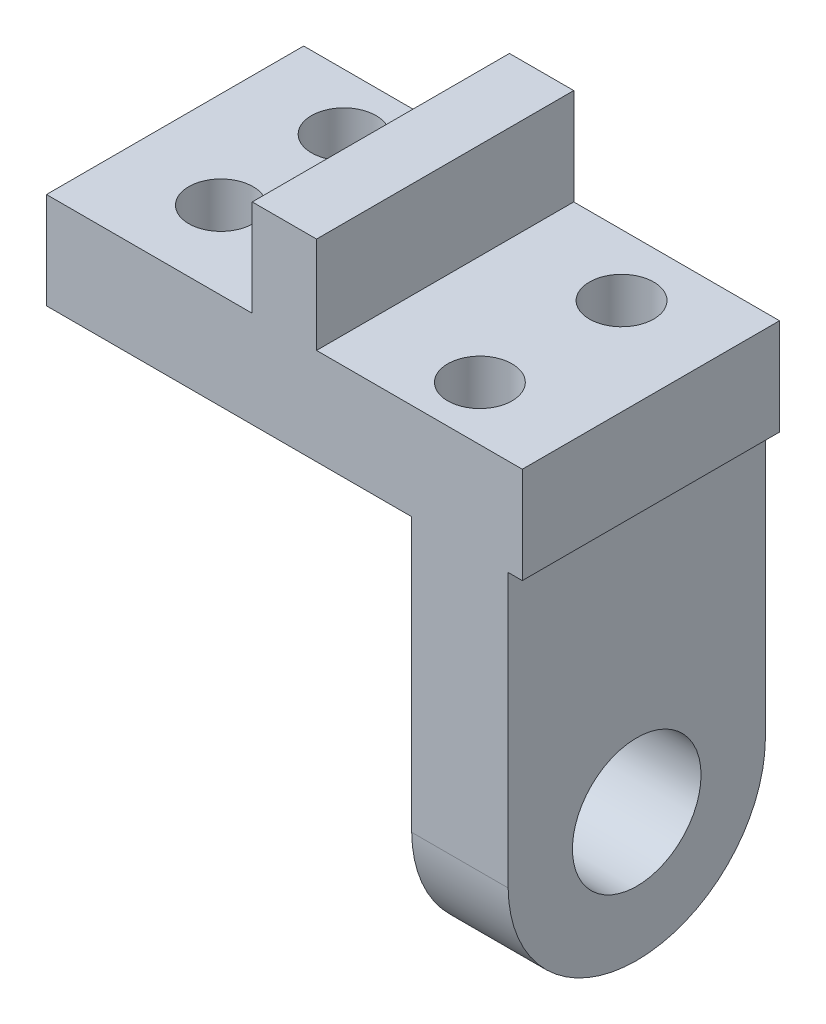
ISO-10303-21;
HEADER;
FILE_DESCRIPTION(('STEP AP214'),'2;1');
FILE_NAME('part.step','',(''),(''),'','','');
FILE_SCHEMA(('AUTOMOTIVE_DESIGN { 1 0 10303 214 1 1 1 1 }'));
ENDSEC;
DATA;
#1=APPLICATION_CONTEXT('core data for automotive mechanical design processes');
#2=APPLICATION_PROTOCOL_DEFINITION('international standard','automotive_design',2000,#1);
#3=PRODUCT_CONTEXT('',#1,'mechanical');
#4=PRODUCT('Part','Part','',(#3));
#5=PRODUCT_RELATED_PRODUCT_CATEGORY('part','',(#4));
#6=PRODUCT_DEFINITION_FORMATION('','',#4);
#7=PRODUCT_DEFINITION_CONTEXT('part definition',#1,'design');
#8=PRODUCT_DEFINITION('design','',#6,#7);
#9=PRODUCT_DEFINITION_SHAPE('','',#8);
#10=(LENGTH_UNIT() NAMED_UNIT(*) SI_UNIT(.MILLI.,.METRE.));
#11=(NAMED_UNIT(*) PLANE_ANGLE_UNIT() SI_UNIT($,.RADIAN.));
#12=(NAMED_UNIT(*) SI_UNIT($,.STERADIAN.) SOLID_ANGLE_UNIT());
#13=UNCERTAINTY_MEASURE_WITH_UNIT(LENGTH_MEASURE(1.E-05),#10,'distance_accuracy_value','');
#14=(GEOMETRIC_REPRESENTATION_CONTEXT(3) GLOBAL_UNCERTAINTY_ASSIGNED_CONTEXT((#13)) GLOBAL_UNIT_ASSIGNED_CONTEXT((#10,
#11,#12)) REPRESENTATION_CONTEXT('',''));
#15=CARTESIAN_POINT('',(0.,0.,0.));
#16=DIRECTION('',(0.,0.,1.));
#17=DIRECTION('',(1.,0.,0.));
#18=AXIS2_PLACEMENT_3D('',#15,#16,#17);
#19=CARTESIAN_POINT('',(-56.7948717948718,0.,20.));
#20=DIRECTION('',(0.,1.,0.));
#21=DIRECTION('',(0.,0.,1.));
#22=AXIS2_PLACEMENT_3D('',#19,#20,#21);
#23=PLANE('',#22);
#24=CARTESIAN_POINT('',(-41.7948717948718,0.,-11.2384801925491));
#25=DIRECTION('',(0.,1.,0.));
#26=DIRECTION('',(0.,0.,1.));
#27=AXIS2_PLACEMENT_3D('',#24,#25,#26);
#28=CIRCLE('',#27,5.02469610578036);
#29=CARTESIAN_POINT('',(-41.7948717948718,0.,-6.21378408676869));
#30=VERTEX_POINT('',#29);
#31=EDGE_CURVE('E218',#30,#30,#28,.T.);
#32=ORIENTED_EDGE('',*,*,#31,.T.);
#33=EDGE_LOOP('',(#32));
#34=FACE_BOUND('',#33,.T.);
#35=CARTESIAN_POINT('',(-41.7948717948718,0.,7.87493505307092));
#36=DIRECTION('',(0.,1.,0.));
#37=DIRECTION('',(0.,0.,1.));
#38=AXIS2_PLACEMENT_3D('',#35,#36,#37);
#39=CIRCLE('',#38,5.);
#40=CARTESIAN_POINT('',(-41.7948717948718,0.,12.8749350530709));
#41=VERTEX_POINT('',#40);
#42=EDGE_CURVE('E217',#41,#41,#39,.T.);
#43=ORIENTED_EDGE('',*,*,#42,.T.);
#44=EDGE_LOOP('',(#43));
#45=FACE_BOUND('',#44,.T.);
#46=DIRECTION('',(0.,0.,-1.));
#47=VECTOR('',#46,1.);
#48=CARTESIAN_POINT('',(0.,0.,20.));
#49=LINE('',#48,#47);
#50=CARTESIAN_POINT('',(0.,0.,20.));
#51=VERTEX_POINT('',#50);
#52=CARTESIAN_POINT('',(0.,0.,16.0855610603018));
#53=VERTEX_POINT('',#52);
#54=EDGE_CURVE('E58',#51,#53,#49,.T.);
#55=ORIENTED_EDGE('',*,*,#54,.F.);
#56=DIRECTION('',(1.,0.,0.));
#57=VECTOR('',#56,1.);
#58=CARTESIAN_POINT('',(-56.7948717948718,0.,20.));
#59=LINE('',#58,#57);
#60=CARTESIAN_POINT('',(-56.7948717948718,0.,20.));
#61=VERTEX_POINT('',#60);
#62=EDGE_CURVE('E254',#61,#51,#59,.T.);
#63=ORIENTED_EDGE('',*,*,#62,.F.);
#64=DIRECTION('',(0.,0.,-1.));
#65=VECTOR('',#64,1.);
#66=CARTESIAN_POINT('',(-56.7948717948718,0.,20.));
#67=LINE('',#66,#65);
#68=CARTESIAN_POINT('',(-56.7948717948718,0.,-20.));
#69=VERTEX_POINT('',#68);
#70=EDGE_CURVE('E281',#61,#69,#67,.T.);
#71=ORIENTED_EDGE('',*,*,#70,.T.);
#72=DIRECTION('',(1.,0.,0.));
#73=VECTOR('',#72,1.);
#74=CARTESIAN_POINT('',(-56.7948717948718,0.,-20.));
#75=LINE('',#74,#73);
#76=CARTESIAN_POINT('',(0.,0.,-20.));
#77=VERTEX_POINT('',#76);
#78=EDGE_CURVE('E266',#69,#77,#75,.T.);
#79=ORIENTED_EDGE('',*,*,#78,.T.);
#80=CARTESIAN_POINT('',(0.,0.,-14.9231791384759));
#81=VERTEX_POINT('',#80);
#82=EDGE_CURVE('E193',#81,#77,#49,.T.);
#83=ORIENTED_EDGE('',*,*,#82,.F.);
#84=CARTESIAN_POINT('',(2.20512820512817,0.,-10.4357066205714));
#85=DIRECTION('',(0.,1.,0.));
#86=DIRECTION('',(0.,0.,1.));
#87=AXIS2_PLACEMENT_3D('',#84,#85,#86);
#88=CIRCLE('',#87,5.);
#89=CARTESIAN_POINT('',(0.,0.,-5.94823410266688));
#90=VERTEX_POINT('',#89);
#91=EDGE_CURVE('E211',#81,#90,#88,.T.);
#92=ORIENTED_EDGE('',*,*,#91,.T.);
#93=CARTESIAN_POINT('',(0.,0.,7.11061602449279));
#94=VERTEX_POINT('',#93);
#95=EDGE_CURVE('E192',#94,#90,#49,.T.);
#96=ORIENTED_EDGE('',*,*,#95,.F.);
#97=CARTESIAN_POINT('',(2.20512820512817,0.,11.5980885423973));
#98=DIRECTION('',(0.,1.,0.));
#99=DIRECTION('',(0.,0.,1.));
#100=AXIS2_PLACEMENT_3D('',#97,#98,#99);
#101=CIRCLE('',#100,5.);
#102=EDGE_CURVE('E206',#94,#53,#101,.T.);
#103=ORIENTED_EDGE('',*,*,#102,.T.);
#104=EDGE_LOOP('',(#55,#63,#71,#79,#83,#92,#96,#103));
#105=FACE_BOUND('',#104,.T.);
#106=ADVANCED_FACE('F35',(#34,#45,#105),#23,.F.);
#107=CARTESIAN_POINT('',(2.20512820512817,-15.,-10.4357066205714));
#108=DIRECTION('',(0.,1.,0.));
#109=DIRECTION('',(0.,0.,1.));
#110=AXIS2_PLACEMENT_3D('',#107,#108,#109);
#111=CYLINDRICAL_SURFACE('',#110,5.);
#112=CARTESIAN_POINT('',(2.20512820512817,15.,-10.4357066205714));
#113=DIRECTION('',(0.,1.,0.));
#114=DIRECTION('',(0.,0.,1.));
#115=AXIS2_PLACEMENT_3D('',#112,#113,#114);
#116=CIRCLE('',#115,5.);
#117=CARTESIAN_POINT('',(2.20512820512817,15.,-5.43570662057139));
#118=VERTEX_POINT('',#117);
#119=EDGE_CURVE('E208',#118,#118,#116,.T.);
#120=ORIENTED_EDGE('',*,*,#119,.T.);
#121=EDGE_LOOP('',(#120));
#122=FACE_BOUND('',#121,.T.);
#123=DIRECTION('',(0.,1.,0.));
#124=VECTOR('',#123,1.);
#125=CARTESIAN_POINT('',(0.,-15.,-14.9231791384759));
#126=LINE('',#125,#124);
#127=CARTESIAN_POINT('',(0.,7.5,-14.9231791384759));
#128=VERTEX_POINT('',#127);
#129=EDGE_CURVE('E197',#128,#81,#126,.F.);
#130=ORIENTED_EDGE('',*,*,#129,.F.);
#131=CARTESIAN_POINT('',(2.20512820512817,7.5,-10.4357066205714));
#132=DIRECTION('',(0.,1.,0.));
#133=DIRECTION('',(0.,0.,1.));
#134=AXIS2_PLACEMENT_3D('',#131,#132,#133);
#135=CIRCLE('',#134,5.);
#136=CARTESIAN_POINT('',(0.,7.5,-5.94823410266688));
#137=VERTEX_POINT('',#136);
#138=EDGE_CURVE('E200',#128,#137,#135,.F.);
#139=ORIENTED_EDGE('',*,*,#138,.T.);
#140=DIRECTION('',(0.,1.,0.));
#141=VECTOR('',#140,1.);
#142=CARTESIAN_POINT('',(0.,-15.,-5.94823410266688));
#143=LINE('',#142,#141);
#144=EDGE_CURVE('E194',#90,#137,#143,.T.);
#145=ORIENTED_EDGE('',*,*,#144,.F.);
#146=ORIENTED_EDGE('',*,*,#91,.F.);
#147=EDGE_LOOP('',(#130,#139,#145,#146));
#148=FACE_BOUND('',#147,.T.);
#149=ADVANCED_FACE('F311',(#122,#148),#111,.F.);
#150=CARTESIAN_POINT('',(2.20512820512817,-15.,11.5980885423973));
#151=DIRECTION('',(0.,1.,0.));
#152=DIRECTION('',(0.,0.,1.));
#153=AXIS2_PLACEMENT_3D('',#150,#151,#152);
#154=CYLINDRICAL_SURFACE('',#153,5.);
#155=CARTESIAN_POINT('',(2.20512820512817,15.,11.5980885423973));
#156=DIRECTION('',(0.,1.,0.));
#157=DIRECTION('',(0.,0.,1.));
#158=AXIS2_PLACEMENT_3D('',#155,#156,#157);
#159=CIRCLE('',#158,5.);
#160=CARTESIAN_POINT('',(2.20512820512817,15.,16.5980885423973));
#161=VERTEX_POINT('',#160);
#162=EDGE_CURVE('E203',#161,#161,#159,.T.);
#163=ORIENTED_EDGE('',*,*,#162,.T.);
#164=EDGE_LOOP('',(#163));
#165=FACE_BOUND('',#164,.T.);
#166=DIRECTION('',(0.,1.,0.));
#167=VECTOR('',#166,1.);
#168=CARTESIAN_POINT('',(0.,-15.,7.11061602449279));
#169=LINE('',#168,#167);
#170=CARTESIAN_POINT('',(0.,7.5,7.11061602449279));
#171=VERTEX_POINT('',#170);
#172=EDGE_CURVE('E11',#171,#94,#169,.F.);
#173=ORIENTED_EDGE('',*,*,#172,.F.);
#174=CARTESIAN_POINT('',(2.20512820512817,7.5,11.5980885423973));
#175=DIRECTION('',(0.,1.,0.));
#176=DIRECTION('',(0.,0.,1.));
#177=AXIS2_PLACEMENT_3D('',#174,#175,#176);
#178=CIRCLE('',#177,5.);
#179=CARTESIAN_POINT('',(0.,7.5,16.0855610603018));
#180=VERTEX_POINT('',#179);
#181=EDGE_CURVE('E43',#171,#180,#178,.F.);
#182=ORIENTED_EDGE('',*,*,#181,.T.);
#183=DIRECTION('',(0.,1.,0.));
#184=VECTOR('',#183,1.);
#185=CARTESIAN_POINT('',(0.,-15.,16.0855610603018));
#186=LINE('',#185,#184);
#187=EDGE_CURVE('E284',#53,#180,#186,.T.);
#188=ORIENTED_EDGE('',*,*,#187,.F.);
#189=ORIENTED_EDGE('',*,*,#102,.F.);
#190=EDGE_LOOP('',(#173,#182,#188,#189));
#191=FACE_BOUND('',#190,.T.);
#192=ADVANCED_FACE('F290',(#165,#191),#154,.F.);
#193=CARTESIAN_POINT('',(-56.7948717948718,15.,20.));
#194=DIRECTION('',(0.,-1.,0.));
#195=DIRECTION('',(0.,0.,-1.));
#196=AXIS2_PLACEMENT_3D('',#193,#194,#195);
#197=PLANE('',#196);
#198=CARTESIAN_POINT('',(-41.7948717948718,15.,7.87493505307092));
#199=DIRECTION('',(0.,1.,0.));
#200=DIRECTION('',(0.,0.,1.));
#201=AXIS2_PLACEMENT_3D('',#198,#199,#200);
#202=CIRCLE('',#201,5.);
#203=CARTESIAN_POINT('',(-41.7948717948718,15.,12.8749350530709));
#204=VERTEX_POINT('',#203);
#205=EDGE_CURVE('E214',#204,#204,#202,.T.);
#206=ORIENTED_EDGE('',*,*,#205,.F.);
#207=EDGE_LOOP('',(#206));
#208=FACE_BOUND('',#207,.T.);
#209=CARTESIAN_POINT('',(-41.7948717948718,15.,-11.2384801925491));
#210=DIRECTION('',(0.,-1.,0.));
#211=DIRECTION('',(0.,0.,-1.));
#212=AXIS2_PLACEMENT_3D('',#209,#210,#211);
#213=CIRCLE('',#212,5.02469610578036);
#214=CARTESIAN_POINT('',(-41.7948717948718,15.,-16.2631762983294));
#215=VERTEX_POINT('',#214);
#216=EDGE_CURVE('E221',#215,#215,#213,.T.);
#217=ORIENTED_EDGE('',*,*,#216,.T.);
#218=EDGE_LOOP('',(#217));
#219=FACE_BOUND('',#218,.T.);
#220=DIRECTION('',(0.,0.,1.));
#221=VECTOR('',#220,1.);
#222=CARTESIAN_POINT('',(-24.7948717948718,15.,20.));
#223=LINE('',#222,#221);
#224=CARTESIAN_POINT('',(-24.7948717948718,15.,-20.));
#225=VERTEX_POINT('',#224);
#226=CARTESIAN_POINT('',(-24.7948717948718,15.,20.));
#227=VERTEX_POINT('',#226);
#228=EDGE_CURVE('E247',#225,#227,#223,.T.);
#229=ORIENTED_EDGE('',*,*,#228,.F.);
#230=DIRECTION('',(-1.,0.,0.));
#231=VECTOR('',#230,1.);
#232=CARTESIAN_POINT('',(-56.7948717948718,15.,-20.));
#233=LINE('',#232,#231);
#234=CARTESIAN_POINT('',(-56.7948717948718,15.,-20.));
#235=VERTEX_POINT('',#234);
#236=EDGE_CURVE('E270',#225,#235,#233,.T.);
#237=ORIENTED_EDGE('',*,*,#236,.T.);
#238=DIRECTION('',(0.,0.,-1.));
#239=VECTOR('',#238,1.);
#240=CARTESIAN_POINT('',(-56.7948717948718,15.,20.));
#241=LINE('',#240,#239);
#242=CARTESIAN_POINT('',(-56.7948717948718,15.,20.));
#243=VERTEX_POINT('',#242);
#244=EDGE_CURVE('E262',#243,#235,#241,.T.);
#245=ORIENTED_EDGE('',*,*,#244,.F.);
#246=DIRECTION('',(-1.,0.,0.));
#247=VECTOR('',#246,1.);
#248=CARTESIAN_POINT('',(-56.7948717948718,15.,20.));
#249=LINE('',#248,#247);
#250=EDGE_CURVE('E258',#227,#243,#249,.T.);
#251=ORIENTED_EDGE('',*,*,#250,.F.);
#252=EDGE_LOOP('',(#229,#237,#245,#251));
#253=FACE_BOUND('',#252,.T.);
#254=ADVANCED_FACE('F329',(#208,#219,#253),#197,.F.);
#255=CARTESIAN_POINT('',(-56.7948717948718,15.,20.));
#256=DIRECTION('',(1.,0.,0.));
#257=DIRECTION('',(0.,0.,-1.));
#258=AXIS2_PLACEMENT_3D('',#255,#256,#257);
#259=PLANE('',#258);
#260=DIRECTION('',(0.,-1.,0.));
#261=VECTOR('',#260,1.);
#262=CARTESIAN_POINT('',(-56.7948717948718,15.,-20.));
#263=LINE('',#262,#261);
#264=EDGE_CURVE('E249',#235,#69,#263,.T.);
#265=ORIENTED_EDGE('',*,*,#264,.T.);
#266=ORIENTED_EDGE('',*,*,#70,.F.);
#267=DIRECTION('',(0.,-1.,0.));
#268=VECTOR('',#267,1.);
#269=CARTESIAN_POINT('',(-56.7948717948718,15.,20.));
#270=LINE('',#269,#268);
#271=EDGE_CURVE('E250',#243,#61,#270,.T.);
#272=ORIENTED_EDGE('',*,*,#271,.F.);
#273=ORIENTED_EDGE('',*,*,#244,.T.);
#274=EDGE_LOOP('',(#265,#266,#272,#273));
#275=FACE_BOUND('',#274,.T.);
#276=ADVANCED_FACE('F37',(#275),#259,.F.);
#277=CARTESIAN_POINT('',(15.,0.,20.));
#278=VERTEX_POINT('',#277);
#279=CARTESIAN_POINT('',(17.2051282051282,0.,20.));
#280=VERTEX_POINT('',#279);
#281=EDGE_CURVE('E50',#278,#280,#59,.T.);
#282=ORIENTED_EDGE('',*,*,#281,.F.);
#283=DIRECTION('',(0.,0.,-1.));
#284=VECTOR('',#283,1.);
#285=CARTESIAN_POINT('',(15.,0.,20.));
#286=LINE('',#285,#284);
#287=CARTESIAN_POINT('',(15.,0.,-20.));
#288=VERTEX_POINT('',#287);
#289=EDGE_CURVE('E156',#278,#288,#286,.T.);
#290=ORIENTED_EDGE('',*,*,#289,.T.);
#291=CARTESIAN_POINT('',(17.2051282051282,0.,-20.));
#292=VERTEX_POINT('',#291);
#293=EDGE_CURVE('E265',#288,#292,#75,.T.);
#294=ORIENTED_EDGE('',*,*,#293,.T.);
#295=DIRECTION('',(0.,0.,-1.));
#296=VECTOR('',#295,1.);
#297=CARTESIAN_POINT('',(17.2051282051282,0.,20.));
#298=LINE('',#297,#296);
#299=EDGE_CURVE('E278',#280,#292,#298,.T.);
#300=ORIENTED_EDGE('',*,*,#299,.F.);
#301=EDGE_LOOP('',(#282,#290,#294,#300));
#302=FACE_BOUND('',#301,.T.);
#303=ADVANCED_FACE('F313',(#302),#23,.F.);
#304=CARTESIAN_POINT('',(17.2051282051282,15.,20.));
#305=DIRECTION('',(-1.,0.,0.));
#306=DIRECTION('',(0.,0.,1.));
#307=AXIS2_PLACEMENT_3D('',#304,#305,#306);
#308=PLANE('',#307);
#309=DIRECTION('',(0.,1.,0.));
#310=VECTOR('',#309,1.);
#311=CARTESIAN_POINT('',(17.2051282051282,15.,-20.));
#312=LINE('',#311,#310);
#313=CARTESIAN_POINT('',(17.2051282051282,15.,-20.));
#314=VERTEX_POINT('',#313);
#315=EDGE_CURVE('E268',#292,#314,#312,.T.);
#316=ORIENTED_EDGE('',*,*,#315,.T.);
#317=DIRECTION('',(0.,0.,-1.));
#318=VECTOR('',#317,1.);
#319=CARTESIAN_POINT('',(17.2051282051282,15.,20.));
#320=LINE('',#319,#318);
#321=CARTESIAN_POINT('',(17.2051282051282,15.,20.));
#322=VERTEX_POINT('',#321);
#323=EDGE_CURVE('E275',#322,#314,#320,.T.);
#324=ORIENTED_EDGE('',*,*,#323,.F.);
#325=DIRECTION('',(0.,1.,0.));
#326=VECTOR('',#325,1.);
#327=CARTESIAN_POINT('',(17.2051282051282,15.,20.));
#328=LINE('',#327,#326);
#329=EDGE_CURVE('E256',#280,#322,#328,.T.);
#330=ORIENTED_EDGE('',*,*,#329,.F.);
#331=ORIENTED_EDGE('',*,*,#299,.T.);
#332=EDGE_LOOP('',(#316,#324,#330,#331));
#333=FACE_BOUND('',#332,.T.);
#334=ADVANCED_FACE('F322',(#333),#308,.F.);
#335=ORIENTED_EDGE('',*,*,#162,.F.);
#336=EDGE_LOOP('',(#335));
#337=FACE_BOUND('',#336,.T.);
#338=ORIENTED_EDGE('',*,*,#119,.F.);
#339=EDGE_LOOP('',(#338));
#340=FACE_BOUND('',#339,.T.);
#341=CARTESIAN_POINT('',(-14.7948717948718,15.,-20.));
#342=VERTEX_POINT('',#341);
#343=EDGE_CURVE('E253',#314,#342,#233,.T.);
#344=ORIENTED_EDGE('',*,*,#343,.T.);
#345=DIRECTION('',(0.,0.,1.));
#346=VECTOR('',#345,1.);
#347=CARTESIAN_POINT('',(-14.7948717948718,15.,20.));
#348=LINE('',#347,#346);
#349=CARTESIAN_POINT('',(-14.7948717948718,15.,20.));
#350=VERTEX_POINT('',#349);
#351=EDGE_CURVE('E237',#342,#350,#348,.T.);
#352=ORIENTED_EDGE('',*,*,#351,.T.);
#353=EDGE_CURVE('E259',#322,#350,#249,.T.);
#354=ORIENTED_EDGE('',*,*,#353,.F.);
#355=ORIENTED_EDGE('',*,*,#323,.T.);
#356=EDGE_LOOP('',(#344,#352,#354,#355));
#357=FACE_BOUND('',#356,.T.);
#358=ADVANCED_FACE('F327',(#337,#340,#357),#197,.F.);
#359=CARTESIAN_POINT('',(0.,0.,20.));
#360=DIRECTION('',(0.,0.,1.));
#361=DIRECTION('',(1.,0.,0.));
#362=AXIS2_PLACEMENT_3D('',#359,#360,#361);
#363=PLANE('',#362);
#364=ORIENTED_EDGE('',*,*,#62,.T.);
#365=DIRECTION('',(0.,-1.,0.));
#366=VECTOR('',#365,1.);
#367=CARTESIAN_POINT('',(0.,0.,20.));
#368=LINE('',#367,#366);
#369=CARTESIAN_POINT('',(0.,-42.5,20.));
#370=VERTEX_POINT('',#369);
#371=EDGE_CURVE('E164',#51,#370,#368,.T.);
#372=ORIENTED_EDGE('',*,*,#371,.T.);
#373=DIRECTION('',(-1.,0.,0.));
#374=VECTOR('',#373,1.);
#375=CARTESIAN_POINT('',(15.,-42.5,20.));
#376=LINE('',#375,#374);
#377=CARTESIAN_POINT('',(15.,-42.5,20.));
#378=VERTEX_POINT('',#377);
#379=EDGE_CURVE('E161',#378,#370,#376,.T.);
#380=ORIENTED_EDGE('',*,*,#379,.F.);
#381=DIRECTION('',(0.,-1.,0.));
#382=VECTOR('',#381,1.);
#383=CARTESIAN_POINT('',(15.,0.,20.));
#384=LINE('',#383,#382);
#385=EDGE_CURVE('E149',#278,#378,#384,.T.);
#386=ORIENTED_EDGE('',*,*,#385,.F.);
#387=ORIENTED_EDGE('',*,*,#281,.T.);
#388=ORIENTED_EDGE('',*,*,#329,.T.);
#389=ORIENTED_EDGE('',*,*,#353,.T.);
#390=DIRECTION('',(0.,-1.,0.));
#391=VECTOR('',#390,1.);
#392=CARTESIAN_POINT('',(-14.7948717948718,30.,20.));
#393=LINE('',#392,#391);
#394=CARTESIAN_POINT('',(-14.7948717948718,30.,20.));
#395=VERTEX_POINT('',#394);
#396=EDGE_CURVE('E241',#395,#350,#393,.T.);
#397=ORIENTED_EDGE('',*,*,#396,.F.);
#398=DIRECTION('',(1.,0.,0.));
#399=VECTOR('',#398,1.);
#400=CARTESIAN_POINT('',(-24.7948717948718,30.,20.));
#401=LINE('',#400,#399);
#402=CARTESIAN_POINT('',(-24.7948717948718,30.,20.));
#403=VERTEX_POINT('',#402);
#404=EDGE_CURVE('E230',#403,#395,#401,.T.);
#405=ORIENTED_EDGE('',*,*,#404,.F.);
#406=DIRECTION('',(0.,-1.,0.));
#407=VECTOR('',#406,1.);
#408=CARTESIAN_POINT('',(-24.7948717948718,30.,20.));
#409=LINE('',#408,#407);
#410=EDGE_CURVE('E238',#403,#227,#409,.T.);
#411=ORIENTED_EDGE('',*,*,#410,.T.);
#412=ORIENTED_EDGE('',*,*,#250,.T.);
#413=ORIENTED_EDGE('',*,*,#271,.T.);
#414=EDGE_LOOP('',(#364,#372,#380,#386,#387,#388,#389,#397,#405,#411,#412,#413));
#415=FACE_BOUND('',#414,.T.);
#416=ADVANCED_FACE('F162',(#415),#363,.T.);
#417=CARTESIAN_POINT('',(0.,0.,-20.));
#418=DIRECTION('',(0.,0.,1.));
#419=DIRECTION('',(1.,0.,0.));
#420=AXIS2_PLACEMENT_3D('',#417,#418,#419);
#421=PLANE('',#420);
#422=ORIENTED_EDGE('',*,*,#293,.F.);
#423=DIRECTION('',(0.,-1.,0.));
#424=VECTOR('',#423,1.);
#425=CARTESIAN_POINT('',(15.,0.,-20.));
#426=LINE('',#425,#424);
#427=CARTESIAN_POINT('',(15.,-42.5,-20.));
#428=VERTEX_POINT('',#427);
#429=EDGE_CURVE('E172',#288,#428,#426,.T.);
#430=ORIENTED_EDGE('',*,*,#429,.T.);
#431=DIRECTION('',(-1.,0.,0.));
#432=VECTOR('',#431,1.);
#433=CARTESIAN_POINT('',(15.,-42.5,-20.));
#434=LINE('',#433,#432);
#435=CARTESIAN_POINT('',(0.,-42.5,-20.));
#436=VERTEX_POINT('',#435);
#437=EDGE_CURVE('E168',#428,#436,#434,.T.);
#438=ORIENTED_EDGE('',*,*,#437,.T.);
#439=DIRECTION('',(0.,-1.,0.));
#440=VECTOR('',#439,1.);
#441=CARTESIAN_POINT('',(0.,0.,-20.));
#442=LINE('',#441,#440);
#443=EDGE_CURVE('E186',#77,#436,#442,.T.);
#444=ORIENTED_EDGE('',*,*,#443,.F.);
#445=ORIENTED_EDGE('',*,*,#78,.F.);
#446=ORIENTED_EDGE('',*,*,#264,.F.);
#447=ORIENTED_EDGE('',*,*,#236,.F.);
#448=DIRECTION('',(0.,-1.,0.));
#449=VECTOR('',#448,1.);
#450=CARTESIAN_POINT('',(-24.7948717948718,30.,-20.));
#451=LINE('',#450,#449);
#452=CARTESIAN_POINT('',(-24.7948717948718,30.,-20.));
#453=VERTEX_POINT('',#452);
#454=EDGE_CURVE('E235',#453,#225,#451,.T.);
#455=ORIENTED_EDGE('',*,*,#454,.F.);
#456=DIRECTION('',(1.,0.,0.));
#457=VECTOR('',#456,1.);
#458=CARTESIAN_POINT('',(-24.7948717948718,30.,-20.));
#459=LINE('',#458,#457);
#460=CARTESIAN_POINT('',(-14.7948717948718,30.,-20.));
#461=VERTEX_POINT('',#460);
#462=EDGE_CURVE('E224',#453,#461,#459,.T.);
#463=ORIENTED_EDGE('',*,*,#462,.T.);
#464=DIRECTION('',(0.,-1.,0.));
#465=VECTOR('',#464,1.);
#466=CARTESIAN_POINT('',(-14.7948717948718,30.,-20.));
#467=LINE('',#466,#465);
#468=EDGE_CURVE('E234',#461,#342,#467,.T.);
#469=ORIENTED_EDGE('',*,*,#468,.T.);
#470=ORIENTED_EDGE('',*,*,#343,.F.);
#471=ORIENTED_EDGE('',*,*,#315,.F.);
#472=EDGE_LOOP('',(#422,#430,#438,#444,#445,#446,#447,#455,#463,#469,#470,#471));
#473=FACE_BOUND('',#472,.T.);
#474=ADVANCED_FACE('F343',(#473),#421,.F.);
#475=CARTESIAN_POINT('',(-24.7948717948718,30.,-20.));
#476=DIRECTION('',(1.,0.,0.));
#477=DIRECTION('',(0.,0.,-1.));
#478=AXIS2_PLACEMENT_3D('',#475,#476,#477);
#479=PLANE('',#478);
#480=ORIENTED_EDGE('',*,*,#454,.T.);
#481=ORIENTED_EDGE('',*,*,#228,.T.);
#482=ORIENTED_EDGE('',*,*,#410,.F.);
#483=DIRECTION('',(0.,0.,1.));
#484=VECTOR('',#483,1.);
#485=CARTESIAN_POINT('',(-24.7948717948718,30.,-20.));
#486=LINE('',#485,#484);
#487=EDGE_CURVE('E232',#453,#403,#486,.T.);
#488=ORIENTED_EDGE('',*,*,#487,.F.);
#489=EDGE_LOOP('',(#480,#481,#482,#488));
#490=FACE_BOUND('',#489,.T.);
#491=ADVANCED_FACE('F352',(#490),#479,.F.);
#492=CARTESIAN_POINT('',(-14.7948717948718,30.,-20.));
#493=DIRECTION('',(1.,0.,0.));
#494=DIRECTION('',(0.,0.,-1.));
#495=AXIS2_PLACEMENT_3D('',#492,#493,#494);
#496=PLANE('',#495);
#497=ORIENTED_EDGE('',*,*,#351,.F.);
#498=ORIENTED_EDGE('',*,*,#468,.F.);
#499=DIRECTION('',(0.,0.,1.));
#500=VECTOR('',#499,1.);
#501=CARTESIAN_POINT('',(-14.7948717948718,30.,-20.));
#502=LINE('',#501,#500);
#503=EDGE_CURVE('E227',#461,#395,#502,.T.);
#504=ORIENTED_EDGE('',*,*,#503,.T.);
#505=ORIENTED_EDGE('',*,*,#396,.T.);
#506=EDGE_LOOP('',(#497,#498,#504,#505));
#507=FACE_BOUND('',#506,.T.);
#508=ADVANCED_FACE('F361',(#507),#496,.T.);
#509=CARTESIAN_POINT('',(0.,30.,0.));
#510=DIRECTION('',(0.,-1.,0.));
#511=DIRECTION('',(0.,0.,-1.));
#512=AXIS2_PLACEMENT_3D('',#509,#510,#511);
#513=PLANE('',#512);
#514=ORIENTED_EDGE('',*,*,#462,.F.);
#515=ORIENTED_EDGE('',*,*,#487,.T.);
#516=ORIENTED_EDGE('',*,*,#404,.T.);
#517=ORIENTED_EDGE('',*,*,#503,.F.);
#518=EDGE_LOOP('',(#514,#515,#516,#517));
#519=FACE_BOUND('',#518,.T.);
#520=ADVANCED_FACE('F358',(#519),#513,.F.);
#521=CARTESIAN_POINT('',(-41.7948717948718,29.2119867591957,-11.2384801925491));
#522=DIRECTION('',(0.,-1.,0.));
#523=DIRECTION('',(0.,0.,-1.));
#524=AXIS2_PLACEMENT_3D('',#521,#522,#523);
#525=CYLINDRICAL_SURFACE('',#524,5.02469610578036);
#526=ORIENTED_EDGE('',*,*,#216,.F.);
#527=EDGE_LOOP('',(#526));
#528=FACE_BOUND('',#527,.T.);
#529=ORIENTED_EDGE('',*,*,#31,.F.);
#530=EDGE_LOOP('',(#529));
#531=FACE_BOUND('',#530,.T.);
#532=ADVANCED_FACE('F389',(#528,#531),#525,.F.);
#533=CARTESIAN_POINT('',(-41.7948717948718,-15.,7.87493505307092));
#534=DIRECTION('',(0.,1.,0.));
#535=DIRECTION('',(0.,0.,1.));
#536=AXIS2_PLACEMENT_3D('',#533,#534,#535);
#537=CYLINDRICAL_SURFACE('',#536,5.);
#538=ORIENTED_EDGE('',*,*,#205,.T.);
#539=EDGE_LOOP('',(#538));
#540=FACE_BOUND('',#539,.T.);
#541=ORIENTED_EDGE('',*,*,#42,.F.);
#542=EDGE_LOOP('',(#541));
#543=FACE_BOUND('',#542,.T.);
#544=ADVANCED_FACE('F392',(#540,#543),#537,.F.);
#545=CARTESIAN_POINT('',(15.,0.,0.));
#546=DIRECTION('',(1.,0.,0.));
#547=DIRECTION('',(0.,0.,-1.));
#548=AXIS2_PLACEMENT_3D('',#545,#546,#547);
#549=PLANE('',#548);
#550=CARTESIAN_POINT('',(15.,-42.2689198039577,0.));
#551=DIRECTION('',(1.,0.,0.));
#552=DIRECTION('',(0.,0.,-1.));
#553=AXIS2_PLACEMENT_3D('',#550,#551,#552);
#554=CIRCLE('',#553,10.);
#555=CARTESIAN_POINT('',(15.,-42.2689198039577,-10.));
#556=VERTEX_POINT('',#555);
#557=EDGE_CURVE('E174',#556,#556,#554,.T.);
#558=ORIENTED_EDGE('',*,*,#557,.F.);
#559=EDGE_LOOP('',(#558));
#560=FACE_BOUND('',#559,.T.);
#561=ORIENTED_EDGE('',*,*,#289,.F.);
#562=ORIENTED_EDGE('',*,*,#385,.T.);
#563=CARTESIAN_POINT('',(15.,-42.2689198039577,0.));
#564=DIRECTION('',(1.,0.,0.));
#565=DIRECTION('',(0.,0.,-1.));
#566=AXIS2_PLACEMENT_3D('',#563,#564,#565);
#567=CIRCLE('',#566,20.0013349068757);
#568=EDGE_CURVE('E154',#378,#428,#567,.T.);
#569=ORIENTED_EDGE('',*,*,#568,.T.);
#570=ORIENTED_EDGE('',*,*,#429,.F.);
#571=EDGE_LOOP('',(#561,#562,#569,#570));
#572=FACE_BOUND('',#571,.T.);
#573=ADVANCED_FACE('F151',(#560,#572),#549,.T.);
#574=CARTESIAN_POINT('',(15.,7.5,0.));
#575=DIRECTION('',(0.,1.,0.));
#576=DIRECTION('',(0.,0.,1.));
#577=AXIS2_PLACEMENT_3D('',#574,#575,#576);
#578=PLANE('',#577);
#579=ORIENTED_EDGE('',*,*,#138,.F.);
#580=DIRECTION('',(0.,0.,-1.));
#581=VECTOR('',#580,1.);
#582=CARTESIAN_POINT('',(0.,7.5,0.));
#583=LINE('',#582,#581);
#584=EDGE_CURVE('E179',#137,#128,#583,.T.);
#585=ORIENTED_EDGE('',*,*,#584,.F.);
#586=EDGE_LOOP('',(#579,#585));
#587=FACE_BOUND('',#586,.T.);
#588=ADVANCED_FACE('F299',(#587),#578,.T.);
#589=ORIENTED_EDGE('',*,*,#181,.F.);
#590=EDGE_CURVE('E182',#180,#171,#583,.T.);
#591=ORIENTED_EDGE('',*,*,#590,.F.);
#592=EDGE_LOOP('',(#589,#591));
#593=FACE_BOUND('',#592,.T.);
#594=ADVANCED_FACE('F297',(#593),#578,.T.);
#595=CARTESIAN_POINT('',(0.,0.,0.));
#596=DIRECTION('',(1.,0.,0.));
#597=DIRECTION('',(0.,0.,-1.));
#598=AXIS2_PLACEMENT_3D('',#595,#596,#597);
#599=PLANE('',#598);
#600=CARTESIAN_POINT('',(0.,-42.2689198039577,0.));
#601=DIRECTION('',(1.,0.,0.));
#602=DIRECTION('',(0.,0.,-1.));
#603=AXIS2_PLACEMENT_3D('',#600,#601,#602);
#604=CIRCLE('',#603,10.);
#605=CARTESIAN_POINT('',(0.,-42.2689198039577,-10.));
#606=VERTEX_POINT('',#605);
#607=EDGE_CURVE('E158',#606,#606,#604,.T.);
#608=ORIENTED_EDGE('',*,*,#607,.T.);
#609=EDGE_LOOP('',(#608));
#610=FACE_BOUND('',#609,.T.);
#611=ORIENTED_EDGE('',*,*,#129,.T.);
#612=ORIENTED_EDGE('',*,*,#82,.T.);
#613=ORIENTED_EDGE('',*,*,#443,.T.);
#614=CARTESIAN_POINT('',(0.,-42.2689198039577,0.));
#615=DIRECTION('',(1.,0.,0.));
#616=DIRECTION('',(0.,0.,-1.));
#617=AXIS2_PLACEMENT_3D('',#614,#615,#616);
#618=CIRCLE('',#617,20.0013349068757);
#619=EDGE_CURVE('E184',#370,#436,#618,.T.);
#620=ORIENTED_EDGE('',*,*,#619,.F.);
#621=ORIENTED_EDGE('',*,*,#371,.F.);
#622=ORIENTED_EDGE('',*,*,#54,.T.);
#623=ORIENTED_EDGE('',*,*,#187,.T.);
#624=ORIENTED_EDGE('',*,*,#590,.T.);
#625=ORIENTED_EDGE('',*,*,#172,.T.);
#626=ORIENTED_EDGE('',*,*,#95,.T.);
#627=ORIENTED_EDGE('',*,*,#144,.T.);
#628=ORIENTED_EDGE('',*,*,#584,.T.);
#629=EDGE_LOOP('',(#611,#612,#613,#620,#621,#622,#623,#624,#625,#626,#627,#628));
#630=FACE_BOUND('',#629,.T.);
#631=ADVANCED_FACE('F296',(#610,#630),#599,.F.);
#632=CARTESIAN_POINT('',(15.,-42.2689198039577,0.));
#633=DIRECTION('',(-1.,0.,0.));
#634=DIRECTION('',(0.,0.,1.));
#635=AXIS2_PLACEMENT_3D('',#632,#633,#634);
#636=CYLINDRICAL_SURFACE('',#635,20.0013349068757);
#637=ORIENTED_EDGE('',*,*,#619,.T.);
#638=ORIENTED_EDGE('',*,*,#437,.F.);
#639=ORIENTED_EDGE('',*,*,#568,.F.);
#640=ORIENTED_EDGE('',*,*,#379,.T.);
#641=EDGE_LOOP('',(#637,#638,#639,#640));
#642=FACE_BOUND('',#641,.T.);
#643=ADVANCED_FACE('F170',(#642),#636,.T.);
#644=CARTESIAN_POINT('',(15.,-42.2689198039577,0.));
#645=DIRECTION('',(-1.,0.,0.));
#646=DIRECTION('',(0.,0.,1.));
#647=AXIS2_PLACEMENT_3D('',#644,#645,#646);
#648=CYLINDRICAL_SURFACE('',#647,10.);
#649=ORIENTED_EDGE('',*,*,#557,.T.);
#650=EDGE_LOOP('',(#649));
#651=FACE_BOUND('',#650,.T.);
#652=ORIENTED_EDGE('',*,*,#607,.F.);
#653=EDGE_LOOP('',(#652));
#654=FACE_BOUND('',#653,.T.);
#655=ADVANCED_FACE('F482',(#651,#654),#648,.F.);
#656=CLOSED_SHELL('',(#106,#149,#192,#254,#276,#303,#334,#358,#416,#474,#491,#508,#520,#532,
#544,#573,#588,#594,#631,#643,#655));
#657=MANIFOLD_SOLID_BREP('B2',#656);
#658=ADVANCED_BREP_SHAPE_REPRESENTATION('',(#18,#657),#14);
#659=SHAPE_DEFINITION_REPRESENTATION(#9,#658);
ENDSEC;
END-ISO-10303-21;
